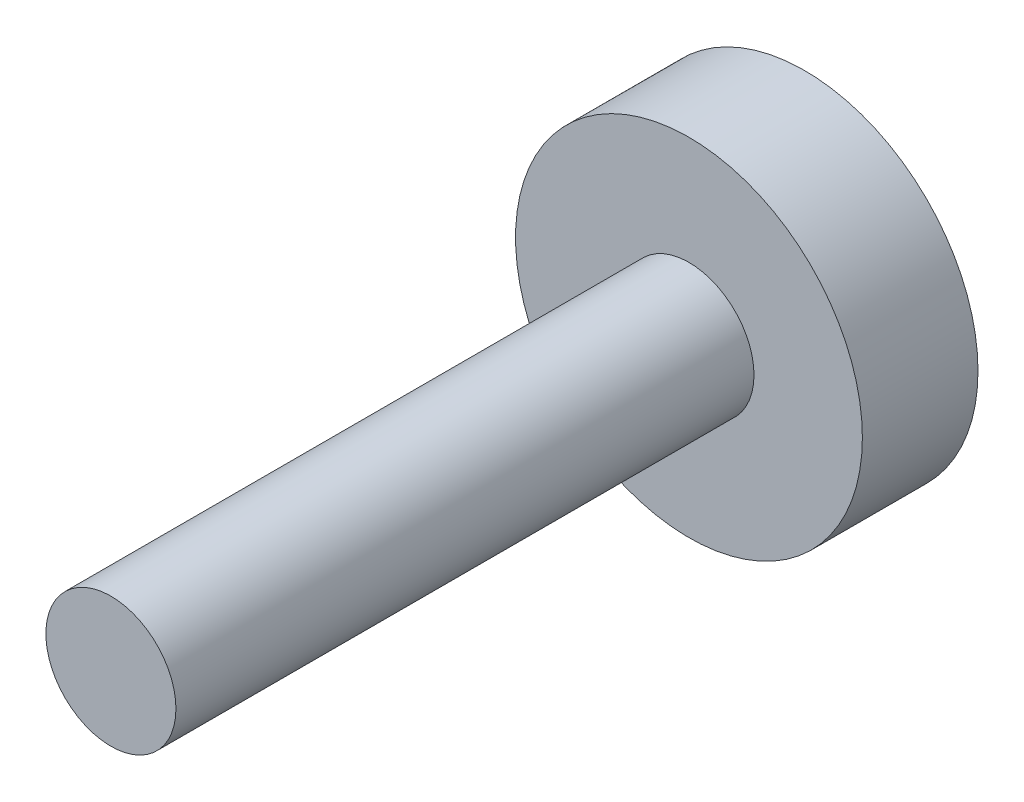
ISO-10303-21;
HEADER;
FILE_DESCRIPTION(('STEP AP214'),'2;1');
FILE_NAME('part.step','',(''),(''),'','','');
FILE_SCHEMA(('AUTOMOTIVE_DESIGN { 1 0 10303 214 1 1 1 1 }'));
ENDSEC;
DATA;
#1=APPLICATION_CONTEXT('core data for automotive mechanical design processes');
#2=APPLICATION_PROTOCOL_DEFINITION('international standard','automotive_design',2000,#1);
#3=PRODUCT_CONTEXT('',#1,'mechanical');
#4=PRODUCT('Part','Part','',(#3));
#5=PRODUCT_RELATED_PRODUCT_CATEGORY('part','',(#4));
#6=PRODUCT_DEFINITION_FORMATION('','',#4);
#7=PRODUCT_DEFINITION_CONTEXT('part definition',#1,'design');
#8=PRODUCT_DEFINITION('design','',#6,#7);
#9=PRODUCT_DEFINITION_SHAPE('','',#8);
#10=(LENGTH_UNIT() NAMED_UNIT(*) SI_UNIT(.MILLI.,.METRE.));
#11=(NAMED_UNIT(*) PLANE_ANGLE_UNIT() SI_UNIT($,.RADIAN.));
#12=(NAMED_UNIT(*) SI_UNIT($,.STERADIAN.) SOLID_ANGLE_UNIT());
#13=UNCERTAINTY_MEASURE_WITH_UNIT(LENGTH_MEASURE(1.E-05),#10,'distance_accuracy_value','');
#14=(GEOMETRIC_REPRESENTATION_CONTEXT(3) GLOBAL_UNCERTAINTY_ASSIGNED_CONTEXT((#13)) GLOBAL_UNIT_ASSIGNED_CONTEXT((#10,
#11,#12)) REPRESENTATION_CONTEXT('',''));
#15=CARTESIAN_POINT('',(0.,0.,0.));
#16=DIRECTION('',(0.,0.,1.));
#17=DIRECTION('',(1.,0.,0.));
#18=AXIS2_PLACEMENT_3D('',#15,#16,#17);
#19=CARTESIAN_POINT('',(0.,0.,12.));
#20=DIRECTION('',(0.,0.,-1.));
#21=DIRECTION('',(-1.,0.,0.));
#22=AXIS2_PLACEMENT_3D('',#19,#20,#21);
#23=CYLINDRICAL_SURFACE('',#22,1.125);
#24=CARTESIAN_POINT('',(0.,0.,2.));
#25=DIRECTION('',(0.,0.,1.));
#26=DIRECTION('',(1.,0.,0.));
#27=AXIS2_PLACEMENT_3D('',#24,#25,#26);
#28=CIRCLE('',#27,1.125);
#29=CARTESIAN_POINT('',(1.125,0.,2.));
#30=VERTEX_POINT('',#29);
#31=EDGE_CURVE('E51',#30,#30,#28,.T.);
#32=ORIENTED_EDGE('',*,*,#31,.T.);
#33=EDGE_LOOP('',(#32));
#34=FACE_BOUND('',#33,.T.);
#35=CARTESIAN_POINT('',(0.,0.,12.));
#36=DIRECTION('',(0.,0.,1.));
#37=DIRECTION('',(1.,0.,0.));
#38=AXIS2_PLACEMENT_3D('',#35,#36,#37);
#39=CIRCLE('',#38,1.125);
#40=CARTESIAN_POINT('',(1.125,0.,12.));
#41=VERTEX_POINT('',#40);
#42=EDGE_CURVE('E10',#41,#41,#39,.T.);
#43=ORIENTED_EDGE('',*,*,#42,.F.);
#44=EDGE_LOOP('',(#43));
#45=FACE_BOUND('',#44,.T.);
#46=ADVANCED_FACE('F36',(#34,#45),#23,.T.);
#47=CARTESIAN_POINT('',(0.,0.,12.));
#48=DIRECTION('',(0.,0.,1.));
#49=DIRECTION('',(1.,0.,0.));
#50=AXIS2_PLACEMENT_3D('',#47,#48,#49);
#51=PLANE('',#50);
#52=ORIENTED_EDGE('',*,*,#42,.T.);
#53=EDGE_LOOP('',(#52));
#54=FACE_BOUND('',#53,.T.);
#55=ADVANCED_FACE('F61',(#54),#51,.T.);
#56=CARTESIAN_POINT('',(0.,0.,2.));
#57=DIRECTION('',(0.,0.,1.));
#58=DIRECTION('',(1.,0.,0.));
#59=AXIS2_PLACEMENT_3D('',#56,#57,#58);
#60=PLANE('',#59);
#61=CARTESIAN_POINT('',(0.,0.,2.));
#62=DIRECTION('',(0.,0.,1.));
#63=DIRECTION('',(1.,0.,0.));
#64=AXIS2_PLACEMENT_3D('',#61,#62,#63);
#65=CIRCLE('',#64,3.);
#66=CARTESIAN_POINT('',(3.,0.,2.));
#67=VERTEX_POINT('',#66);
#68=EDGE_CURVE('E42',#67,#67,#65,.T.);
#69=ORIENTED_EDGE('',*,*,#68,.T.);
#70=EDGE_LOOP('',(#69));
#71=FACE_BOUND('',#70,.T.);
#72=ORIENTED_EDGE('',*,*,#31,.F.);
#73=EDGE_LOOP('',(#72));
#74=FACE_BOUND('',#73,.T.);
#75=ADVANCED_FACE('F58',(#71,#74),#60,.T.);
#76=CARTESIAN_POINT('',(0.,0.,2.));
#77=DIRECTION('',(0.,0.,-1.));
#78=DIRECTION('',(-1.,0.,0.));
#79=AXIS2_PLACEMENT_3D('',#76,#77,#78);
#80=CYLINDRICAL_SURFACE('',#79,3.);
#81=ORIENTED_EDGE('',*,*,#68,.F.);
#82=EDGE_LOOP('',(#81));
#83=FACE_BOUND('',#82,.T.);
#84=CARTESIAN_POINT('',(0.,0.,0.));
#85=DIRECTION('',(0.,0.,1.));
#86=DIRECTION('',(1.,0.,0.));
#87=AXIS2_PLACEMENT_3D('',#84,#85,#86);
#88=CIRCLE('',#87,3.);
#89=CARTESIAN_POINT('',(3.,0.,0.));
#90=VERTEX_POINT('',#89);
#91=EDGE_CURVE('E46',#90,#90,#88,.T.);
#92=ORIENTED_EDGE('',*,*,#91,.T.);
#93=EDGE_LOOP('',(#92));
#94=FACE_BOUND('',#93,.T.);
#95=ADVANCED_FACE('F60',(#83,#94),#80,.T.);
#96=CARTESIAN_POINT('',(0.,0.,0.));
#97=DIRECTION('',(0.,0.,1.));
#98=DIRECTION('',(1.,0.,0.));
#99=AXIS2_PLACEMENT_3D('',#96,#97,#98);
#100=PLANE('',#99);
#101=ORIENTED_EDGE('',*,*,#91,.F.);
#102=EDGE_LOOP('',(#101));
#103=FACE_BOUND('',#102,.T.);
#104=ADVANCED_FACE('F67',(#103),#100,.F.);
#105=CLOSED_SHELL('',(#46,#55,#75,#95,#104));
#106=MANIFOLD_SOLID_BREP('B2',#105);
#107=ADVANCED_BREP_SHAPE_REPRESENTATION('',(#18,#106),#14);
#108=SHAPE_DEFINITION_REPRESENTATION(#9,#107);
ENDSEC;
END-ISO-10303-21;
